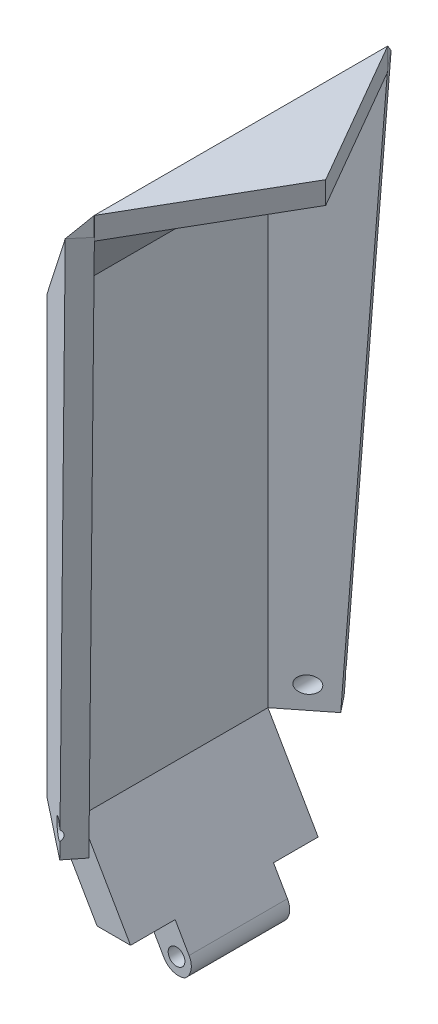
ISO-10303-21;
HEADER;
FILE_DESCRIPTION(('STEP AP214'),'2;1');
FILE_NAME('part.step','',(''),(''),'','','');
FILE_SCHEMA(('AUTOMOTIVE_DESIGN { 1 0 10303 214 1 1 1 1 }'));
ENDSEC;
DATA;
#1=APPLICATION_CONTEXT('core data for automotive mechanical design processes');
#2=APPLICATION_PROTOCOL_DEFINITION('international standard','automotive_design',2000,#1);
#3=PRODUCT_CONTEXT('',#1,'mechanical');
#4=PRODUCT('Part','Part','',(#3));
#5=PRODUCT_RELATED_PRODUCT_CATEGORY('part','',(#4));
#6=PRODUCT_DEFINITION_FORMATION('','',#4);
#7=PRODUCT_DEFINITION_CONTEXT('part definition',#1,'design');
#8=PRODUCT_DEFINITION('design','',#6,#7);
#9=PRODUCT_DEFINITION_SHAPE('','',#8);
#10=(LENGTH_UNIT() NAMED_UNIT(*) SI_UNIT(.MILLI.,.METRE.));
#11=(NAMED_UNIT(*) PLANE_ANGLE_UNIT() SI_UNIT($,.RADIAN.));
#12=(NAMED_UNIT(*) SI_UNIT($,.STERADIAN.) SOLID_ANGLE_UNIT());
#13=UNCERTAINTY_MEASURE_WITH_UNIT(LENGTH_MEASURE(1.E-05),#10,'distance_accuracy_value','');
#14=(GEOMETRIC_REPRESENTATION_CONTEXT(3) GLOBAL_UNCERTAINTY_ASSIGNED_CONTEXT((#13)) GLOBAL_UNIT_ASSIGNED_CONTEXT((#10,
#11,#12)) REPRESENTATION_CONTEXT('',''));
#15=CARTESIAN_POINT('',(0.,0.,0.));
#16=DIRECTION('',(0.,0.,1.));
#17=DIRECTION('',(1.,0.,0.));
#18=AXIS2_PLACEMENT_3D('',#15,#16,#17);
#19=CARTESIAN_POINT('',(10.6552487881726,61.009489218439,-25.5140098827498));
#20=DIRECTION('',(1.,0.,0.));
#21=DIRECTION('',(0.,0.,-1.));
#22=AXIS2_PLACEMENT_3D('',#19,#20,#21);
#23=PLANE('',#22);
#24=DIRECTION('',(0.,0.999852512753469,-0.0171741882071135));
#25=VECTOR('',#24,1.);
#26=CARTESIAN_POINT('',(10.6552487881726,58.409489218439,-25.4693504067082));
#27=LINE('',#26,#25);
#28=CARTESIAN_POINT('',(10.6552487881726,58.409489218439,-25.4693504067082));
#29=VERTEX_POINT('',#28);
#30=CARTESIAN_POINT('',(10.6552487881726,61.009489218439,-25.5140098827498));
#31=VERTEX_POINT('',#30);
#32=EDGE_CURVE('E217',#29,#31,#27,.T.);
#33=ORIENTED_EDGE('',*,*,#32,.F.);
#34=DIRECTION('',(0.,-0.995398370226501,0.0958231942194899));
#35=VECTOR('',#34,1.);
#36=CARTESIAN_POINT('',(10.6552487881726,60.9898755199771,-25.7177543273187));
#37=LINE('',#36,#35);
#38=CARTESIAN_POINT('',(10.6552487881726,58.8734058101279,-25.5140098827498));
#39=VERTEX_POINT('',#38);
#40=EDGE_CURVE('E375',#39,#29,#37,.T.);
#41=ORIENTED_EDGE('',*,*,#40,.F.);
#42=DIRECTION('',(0.,-1.,0.));
#43=VECTOR('',#42,1.);
#44=CARTESIAN_POINT('',(10.6552487881726,61.009489218439,-25.5140098827498));
#45=LINE('',#44,#43);
#46=EDGE_CURVE('E328',#31,#39,#45,.T.);
#47=ORIENTED_EDGE('',*,*,#46,.F.);
#48=EDGE_LOOP('',(#33,#41,#47));
#49=FACE_BOUND('',#48,.T.);
#50=ADVANCED_FACE('F38',(#49),#23,.T.);
#51=CARTESIAN_POINT('',(-1.03375671481459,-6.59051078156102,2.52181160048272));
#52=DIRECTION('',(0.,1.,0.));
#53=DIRECTION('',(0.,0.,1.));
#54=AXIS2_PLACEMENT_3D('',#51,#52,#53);
#55=PLANE('',#54);
#56=DIRECTION('',(-1.,0.,0.));
#57=VECTOR('',#56,1.);
#58=CARTESIAN_POINT('',(-1.03375671481459,-6.59051078156102,2.52181160048272));
#59=LINE('',#58,#57);
#60=CARTESIAN_POINT('',(2.86624328518541,-6.59051078156102,2.52181160048272));
#61=VERTEX_POINT('',#60);
#62=CARTESIAN_POINT('',(-1.03375671481459,-6.59051078156102,2.52181160048272));
#63=VERTEX_POINT('',#62);
#64=EDGE_CURVE('E270',#61,#63,#59,.T.);
#65=ORIENTED_EDGE('',*,*,#64,.F.);
#66=DIRECTION('',(-0.78460232937221,0.,-0.619999342534895));
#67=VECTOR('',#66,1.);
#68=CARTESIAN_POINT('',(2.86624328518541,-6.59051078156102,2.52181160048272));
#69=LINE('',#68,#67);
#70=CARTESIAN_POINT('',(7.60528130297296,-6.59051078156102,6.26663919693801));
#71=VERTEX_POINT('',#70);
#72=EDGE_CURVE('E346',#71,#61,#69,.T.);
#73=ORIENTED_EDGE('',*,*,#72,.F.);
#74=DIRECTION('',(-0.619999342534895,0.,0.78460232937221));
#75=VECTOR('',#74,1.);
#76=CARTESIAN_POINT('',(7.71812277306325,-6.59051078156102,6.12383956118252));
#77=LINE('',#76,#75);
#78=CARTESIAN_POINT('',(6.10612448247252,-6.59051078156102,8.16380561755026));
#79=VERTEX_POINT('',#78);
#80=EDGE_CURVE('E299',#71,#79,#77,.T.);
#81=ORIENTED_EDGE('',*,*,#80,.T.);
#82=DIRECTION('',(0.78460232937221,0.,0.619999342534895));
#83=VECTOR('',#82,1.);
#84=CARTESIAN_POINT('',(9.16607356702414,-6.59051078156102,10.5818030534364));
#85=LINE('',#84,#83);
#86=EDGE_CURVE('E343',#63,#79,#85,.T.);
#87=ORIENTED_EDGE('',*,*,#86,.F.);
#88=EDGE_LOOP('',(#65,#73,#81,#87));
#89=FACE_BOUND('',#88,.T.);
#90=ADVANCED_FACE('F447',(#89),#55,.F.);
#91=DIRECTION('',(1.,0.,0.));
#92=VECTOR('',#91,1.);
#93=CARTESIAN_POINT('',(2.86624328518541,-6.59051078156102,-19.3441883995173));
#94=LINE('',#93,#92);
#95=CARTESIAN_POINT('',(-1.03375671481459,-6.59051078156102,-19.3441883995173));
#96=VERTEX_POINT('',#95);
#97=CARTESIAN_POINT('',(2.86624328518541,-6.59051078156102,-19.3441883995173));
#98=VERTEX_POINT('',#97);
#99=EDGE_CURVE('E267',#96,#98,#94,.T.);
#100=ORIENTED_EDGE('',*,*,#99,.F.);
#101=DIRECTION('',(-0.785505244815182,0.,0.618854999469053));
#102=VECTOR('',#101,1.);
#103=CARTESIAN_POINT('',(-1.03375671481459,-6.59051078156102,-19.3441883995173));
#104=LINE('',#103,#102);
#105=CARTESIAN_POINT('',(6.11434101300356,-6.59051078156102,-24.9757688946857));
#106=VERTEX_POINT('',#105);
#107=EDGE_CURVE('E355',#106,#96,#104,.T.);
#108=ORIENTED_EDGE('',*,*,#107,.F.);
#109=DIRECTION('',(-0.618854999469053,0.,-0.785505244815181));
#110=VECTOR('',#109,1.);
#111=CARTESIAN_POINT('',(7.7233640116231,-6.59051078156102,-22.9334552581662));
#112=LINE('',#111,#110);
#113=CARTESIAN_POINT('',(7.60796890343815,-6.59051078156102,-23.0799248880198));
#114=VERTEX_POINT('',#113);
#115=EDGE_CURVE('E286',#114,#106,#112,.T.);
#116=ORIENTED_EDGE('',*,*,#115,.F.);
#117=DIRECTION('',(0.785505244815181,0.,-0.618854999469053));
#118=VECTOR('',#117,1.);
#119=CARTESIAN_POINT('',(10.6714393582173,-6.59051078156102,-25.4934593859491));
#120=LINE('',#119,#118);
#121=EDGE_CURVE('E352',#98,#114,#120,.T.);
#122=ORIENTED_EDGE('',*,*,#121,.F.);
#123=EDGE_LOOP('',(#100,#108,#116,#122));
#124=FACE_BOUND('',#123,.T.);
#125=ADVANCED_FACE('F466',(#124),#55,.F.);
#126=CARTESIAN_POINT('',(9.16607356702414,58.409489218439,10.5818030534364));
#127=DIRECTION('',(0.619999342534895,0.,-0.78460232937221));
#128=DIRECTION('',(-0.78460232937221,0.,-0.619999342534895));
#129=AXIS2_PLACEMENT_3D('',#126,#127,#128);
#130=PLANE('',#129);
#131=DIRECTION('',(-0.0466718581353723,-0.998229215578194,-0.0368804938190356));
#132=VECTOR('',#131,1.);
#133=CARTESIAN_POINT('',(9.16607356702414,58.8564351172174,10.5818030534364));
#134=LINE('',#133,#132);
#135=CARTESIAN_POINT('',(6.1975367142933,-4.6353634163107,8.23604032997316));
#136=VERTEX_POINT('',#135);
#137=EDGE_CURVE('E295',#136,#79,#134,.T.);
#138=ORIENTED_EDGE('',*,*,#137,.F.);
#139=CARTESIAN_POINT('',(5.46624328518541,-3.99051078156102,7.65816612762435));
#140=DIRECTION('',(0.619999342534895,0.,-0.78460232937221));
#141=DIRECTION('',(0.78460232937221,0.,0.619999342534895));
#142=AXIS2_PLACEMENT_3D('',#139,#140,#141);
#143=ELLIPSE('',#142,1.242667735616,0.975000000000001);
#144=CARTESIAN_POINT('',(6.25451466882144,-3.41670486860738,8.28106478761744));
#145=VERTEX_POINT('',#144);
#146=EDGE_CURVE('E52',#136,#145,#143,.T.);
#147=ORIENTED_EDGE('',*,*,#146,.T.);
#148=CARTESIAN_POINT('',(9.16607356702414,58.8564351172174,10.5818030534364));
#149=VERTEX_POINT('',#148);
#150=EDGE_CURVE('E296',#149,#145,#134,.T.);
#151=ORIENTED_EDGE('',*,*,#150,.F.);
#152=DIRECTION('',(0.518840292974444,0.750140886581608,0.409991951951196));
#153=VECTOR('',#152,1.);
#154=CARTESIAN_POINT('',(-1.0337567148146,44.109489218439,2.52181160048272));
#155=LINE('',#154,#153);
#156=CARTESIAN_POINT('',(-1.0337567148146,44.109489218439,2.52181160048272));
#157=VERTEX_POINT('',#156);
#158=EDGE_CURVE('E321',#157,#149,#155,.T.);
#159=ORIENTED_EDGE('',*,*,#158,.F.);
#160=DIRECTION('',(0.,-1.,0.));
#161=VECTOR('',#160,1.);
#162=CARTESIAN_POINT('',(-1.03375671481459,58.409489218439,2.52181160048272));
#163=LINE('',#162,#161);
#164=EDGE_CURVE('E361',#157,#63,#163,.T.);
#165=ORIENTED_EDGE('',*,*,#164,.T.);
#166=ORIENTED_EDGE('',*,*,#86,.T.);
#167=EDGE_LOOP('',(#138,#147,#151,#159,#165,#166));
#168=FACE_BOUND('',#167,.T.);
#169=ADVANCED_FACE('F442',(#168),#130,.F.);
#170=CARTESIAN_POINT('',(10.6624675122414,58.409489218439,8.68245338559817));
#171=DIRECTION('',(-0.785504411843749,0.,-0.61885605674826));
#172=DIRECTION('',(-0.61885605674826,0.,0.785504411843749));
#173=AXIS2_PLACEMENT_3D('',#170,#171,#172);
#174=PLANE('',#173);
#175=DIRECTION('',(0.461195463716863,0.66679781567586,-0.585388261973957));
#176=VECTOR('',#175,1.);
#177=CARTESIAN_POINT('',(9.16607356702414,58.8564351172174,10.5818030534364));
#178=LINE('',#177,#176);
#179=CARTESIAN_POINT('',(10.6552487881726,61.009489218439,8.69161600030012));
#180=VERTEX_POINT('',#179);
#181=EDGE_CURVE('E324',#149,#180,#178,.T.);
#182=ORIENTED_EDGE('',*,*,#181,.F.);
#183=DIRECTION('',(0.618671331821346,-0.0244315215937749,-0.785269943353886));
#184=VECTOR('',#183,1.);
#185=CARTESIAN_POINT('',(10.6683299397326,58.7971105500014,8.67501229714437));
#186=LINE('',#185,#184);
#187=CARTESIAN_POINT('',(10.6552487881726,58.7976271287087,8.69161600030012));
#188=VERTEX_POINT('',#187);
#189=EDGE_CURVE('E308',#149,#188,#186,.T.);
#190=ORIENTED_EDGE('',*,*,#189,.T.);
#191=DIRECTION('',(0.,-1.,0.));
#192=VECTOR('',#191,1.);
#193=CARTESIAN_POINT('',(10.6552487881726,61.009489218439,8.69161600030012));
#194=LINE('',#193,#192);
#195=EDGE_CURVE('E333',#180,#188,#194,.T.);
#196=ORIENTED_EDGE('',*,*,#195,.F.);
#197=EDGE_LOOP('',(#182,#190,#196));
#198=FACE_BOUND('',#197,.T.);
#199=ADVANCED_FACE('F436',(#198),#174,.F.);
#200=CARTESIAN_POINT('',(2.86624328518541,58.409489218439,2.52181160048272));
#201=DIRECTION('',(-0.619999342534895,0.,0.78460232937221));
#202=DIRECTION('',(0.78460232937221,0.,0.619999342534895));
#203=AXIS2_PLACEMENT_3D('',#200,#201,#202);
#204=PLANE('',#203);
#205=CARTESIAN_POINT('',(5.46624328518541,-3.99051078156102,4.57635341133937));
#206=DIRECTION('',(-0.619999342534895,0.,0.78460232937221));
#207=DIRECTION('',(0.78460232937221,0.,0.619999342534895));
#208=AXIS2_PLACEMENT_3D('',#205,#206,#207);
#209=ELLIPSE('',#208,1.242667735616,0.975000000000001);
#210=CARTESIAN_POINT('',(6.44124328518541,-3.99051078156102,5.34680659041061));
#211=VERTEX_POINT('',#210);
#212=EDGE_CURVE('E231',#211,#211,#209,.T.);
#213=ORIENTED_EDGE('',*,*,#212,.T.);
#214=EDGE_LOOP('',(#213));
#215=FACE_BOUND('',#214,.T.);
#216=DIRECTION('',(0.518840292974444,0.750140886581608,0.409991951951196));
#217=VECTOR('',#216,1.);
#218=CARTESIAN_POINT('',(7.24920508475906,53.4850207875722,5.9852647822564));
#219=LINE('',#218,#217);
#220=CARTESIAN_POINT('',(2.86624328518541,47.1481211776041,2.52181160048272));
#221=VERTEX_POINT('',#220);
#222=CARTESIAN_POINT('',(10.643542249408,58.3925638687957,8.66749848414715));
#223=VERTEX_POINT('',#222);
#224=EDGE_CURVE('E340',#221,#223,#219,.T.);
#225=ORIENTED_EDGE('',*,*,#224,.T.);
#226=DIRECTION('',(-0.0466718581353723,-0.998229215578194,-0.0368804938190356));
#227=VECTOR('',#226,1.);
#228=CARTESIAN_POINT('',(10.6168113355184,57.8208364881043,8.64637549175152));
#229=LINE('',#228,#227);
#230=EDGE_CURVE('E305',#223,#71,#229,.T.);
#231=ORIENTED_EDGE('',*,*,#230,.T.);
#232=ORIENTED_EDGE('',*,*,#72,.T.);
#233=DIRECTION('',(0.,-1.,0.));
#234=VECTOR('',#233,1.);
#235=CARTESIAN_POINT('',(2.86624328518541,58.409489218439,2.52181160048272));
#236=LINE('',#235,#234);
#237=EDGE_CURVE('E370',#221,#61,#236,.T.);
#238=ORIENTED_EDGE('',*,*,#237,.F.);
#239=EDGE_LOOP('',(#225,#231,#232,#238));
#240=FACE_BOUND('',#239,.T.);
#241=ADVANCED_FACE('F450',(#215,#240),#204,.F.);
#242=CARTESIAN_POINT('',(2.86624328518541,58.409489218439,-19.3441883995173));
#243=DIRECTION('',(-1.,0.,0.));
#244=DIRECTION('',(0.,0.,1.));
#245=AXIS2_PLACEMENT_3D('',#242,#243,#244);
#246=PLANE('',#245);
#247=DIRECTION('',(0.,-1.,0.));
#248=VECTOR('',#247,1.);
#249=CARTESIAN_POINT('',(2.86624328518541,58.409489218439,-19.3441883995173));
#250=LINE('',#249,#248);
#251=CARTESIAN_POINT('',(2.86624328518541,47.1481211776041,-19.3441883995173));
#252=VERTEX_POINT('',#251);
#253=EDGE_CURVE('E367',#252,#98,#250,.T.);
#254=ORIENTED_EDGE('',*,*,#253,.F.);
#255=DIRECTION('',(0.,0.,1.));
#256=VECTOR('',#255,1.);
#257=CARTESIAN_POINT('',(2.86624328518541,47.1481211776041,-19.3441883995173));
#258=LINE('',#257,#256);
#259=EDGE_CURVE('E338',#252,#221,#258,.T.);
#260=ORIENTED_EDGE('',*,*,#259,.T.);
#261=ORIENTED_EDGE('',*,*,#237,.T.);
#262=DIRECTION('',(0.,0.,-1.));
#263=VECTOR('',#262,1.);
#264=CARTESIAN_POINT('',(2.86624328518541,-6.59051078156102,-19.3441883995173));
#265=LINE('',#264,#263);
#266=EDGE_CURVE('E349',#61,#98,#265,.T.);
#267=ORIENTED_EDGE('',*,*,#266,.T.);
#268=EDGE_LOOP('',(#254,#260,#261,#267));
#269=FACE_BOUND('',#268,.T.);
#270=ADVANCED_FACE('F454',(#269),#246,.F.);
#271=CARTESIAN_POINT('',(10.6714393582173,58.409489218439,-25.4934593859491));
#272=DIRECTION('',(-0.618854999469053,0.,-0.785505244815181));
#273=DIRECTION('',(-0.785505244815182,0.,0.618854999469053));
#274=AXIS2_PLACEMENT_3D('',#271,#272,#273);
#275=PLANE('',#274);
#276=CARTESIAN_POINT('',(5.46624328518541,-3.99051078156102,-21.3925808313184));
#277=DIRECTION('',(-0.618854999469053,0.,-0.785505244815181));
#278=DIRECTION('',(-0.785505244815182,0.,0.618854999469053));
#279=AXIS2_PLACEMENT_3D('',#276,#277,#278);
#280=ELLIPSE('',#279,1.24123932518032,0.975000000000001);
#281=CARTESIAN_POINT('',(4.49124328518541,-3.99051078156102,-20.624433669393));
#282=VERTEX_POINT('',#281);
#283=EDGE_CURVE('E228',#282,#282,#280,.T.);
#284=ORIENTED_EDGE('',*,*,#283,.T.);
#285=EDGE_LOOP('',(#284));
#286=FACE_BOUND('',#285,.T.);
#287=ORIENTED_EDGE('',*,*,#121,.T.);
#288=DIRECTION('',(0.0467134976488242,0.998230131130508,-0.0368029134795434));
#289=VECTOR('',#288,1.);
#290=CARTESIAN_POINT('',(10.6498065467254,58.4111299083174,-25.4764161215881));
#291=LINE('',#290,#289);
#292=CARTESIAN_POINT('',(10.649329263725,58.4009307518407,-25.4760400974012));
#293=VERTEX_POINT('',#292);
#294=EDGE_CURVE('E292',#114,#293,#291,.T.);
#295=ORIENTED_EDGE('',*,*,#294,.T.);
#296=DIRECTION('',(-0.519101135037937,-0.750518012836866,0.408970321673502));
#297=VECTOR('',#296,1.);
#298=CARTESIAN_POINT('',(10.662319577838,58.4197121878194,-25.4862744285996));
#299=LINE('',#298,#297);
#300=EDGE_CURVE('E336',#293,#252,#299,.T.);
#301=ORIENTED_EDGE('',*,*,#300,.T.);
#302=ORIENTED_EDGE('',*,*,#253,.T.);
#303=EDGE_LOOP('',(#287,#295,#301,#302));
#304=FACE_BOUND('',#303,.T.);
#305=ADVANCED_FACE('F469',(#286,#304),#275,.F.);
#306=CARTESIAN_POINT('',(9.17781146778277,58.409489218439,-27.389303392615));
#307=DIRECTION('',(-0.785505244815182,0.,0.618854999469053));
#308=DIRECTION('',(0.618854999469053,0.,0.785505244815182));
#309=AXIS2_PLACEMENT_3D('',#306,#307,#308);
#310=PLANE('',#309);
#311=ORIENTED_EDGE('',*,*,#46,.T.);
#312=DIRECTION('',(-0.618854999469053,0.,-0.785505244815181));
#313=VECTOR('',#312,1.);
#314=CARTESIAN_POINT('',(10.7868344664023,58.8734058101279,-25.3469897560955));
#315=LINE('',#314,#313);
#316=CARTESIAN_POINT('',(9.17781146778277,58.8734058101279,-27.389303392615));
#317=VERTEX_POINT('',#316);
#318=EDGE_CURVE('E285',#39,#317,#315,.T.);
#319=ORIENTED_EDGE('',*,*,#318,.T.);
#320=DIRECTION('',(-0.461195026117854,-0.66679718299387,-0.585389327401509));
#321=VECTOR('',#320,1.);
#322=CARTESIAN_POINT('',(10.6552487881726,61.009489218439,-25.5140098827498));
#323=LINE('',#322,#321);
#324=EDGE_CURVE('E312',#31,#317,#323,.T.);
#325=ORIENTED_EDGE('',*,*,#324,.F.);
#326=EDGE_LOOP('',(#311,#319,#325));
#327=FACE_BOUND('',#326,.T.);
#328=ADVANCED_FACE('F409',(#327),#310,.F.);
#329=CARTESIAN_POINT('',(-1.03375671481459,58.409489218439,-19.3441883995173));
#330=DIRECTION('',(0.618854999469053,0.,0.785505244815181));
#331=DIRECTION('',(0.785505244815182,0.,-0.618854999469053));
#332=AXIS2_PLACEMENT_3D('',#329,#330,#331);
#333=PLANE('',#332);
#334=DIRECTION('',(0.0467134976488242,0.998230131130508,-0.0368029134795434));
#335=VECTOR('',#334,1.);
#336=CARTESIAN_POINT('',(6.11434101300356,-6.59051078156102,-24.9757688946857));
#337=LINE('',#336,#335);
#338=CARTESIAN_POINT('',(6.26235222953769,-3.42762931204697,-25.0923785315204));
#339=VERTEX_POINT('',#338);
#340=EDGE_CURVE('E281',#339,#317,#337,.T.);
#341=ORIENTED_EDGE('',*,*,#340,.F.);
#342=CARTESIAN_POINT('',(5.46624328518541,-3.99051078156102,-24.4651694790202));
#343=DIRECTION('',(0.618854999469053,0.,0.785505244815181));
#344=DIRECTION('',(-0.785505244815182,0.,0.618854999469053));
#345=AXIS2_PLACEMENT_3D('',#342,#343,#344);
#346=ELLIPSE('',#345,1.24123932518032,0.975000000000001);
#347=CARTESIAN_POINT('',(6.20630660869124,-4.62527946163393,-25.0482233678367));
#348=VERTEX_POINT('',#347);
#349=EDGE_CURVE('E59',#339,#348,#346,.T.);
#350=ORIENTED_EDGE('',*,*,#349,.T.);
#351=EDGE_CURVE('E282',#106,#348,#337,.T.);
#352=ORIENTED_EDGE('',*,*,#351,.F.);
#353=ORIENTED_EDGE('',*,*,#107,.T.);
#354=DIRECTION('',(0.,-1.,0.));
#355=VECTOR('',#354,1.);
#356=CARTESIAN_POINT('',(-1.03375671481459,58.409489218439,-19.3441883995173));
#357=LINE('',#356,#355);
#358=CARTESIAN_POINT('',(-1.0337567148146,44.109489218439,-19.3441883995173));
#359=VERTEX_POINT('',#358);
#360=EDGE_CURVE('E364',#359,#96,#357,.T.);
#361=ORIENTED_EDGE('',*,*,#360,.F.);
#362=DIRECTION('',(-0.519101135037937,-0.750518012836866,0.408970321673502));
#363=VECTOR('',#362,1.);
#364=CARTESIAN_POINT('',(9.17781146778277,58.8734058101279,-27.389303392615));
#365=LINE('',#364,#363);
#366=EDGE_CURVE('E315',#317,#359,#365,.T.);
#367=ORIENTED_EDGE('',*,*,#366,.F.);
#368=EDGE_LOOP('',(#341,#350,#352,#353,#361,#367));
#369=FACE_BOUND('',#368,.T.);
#370=ADVANCED_FACE('F403',(#369),#333,.F.);
#371=CARTESIAN_POINT('',(-1.03375671481459,58.409489218439,2.52181160048272));
#372=DIRECTION('',(1.,0.,0.));
#373=DIRECTION('',(0.,0.,-1.));
#374=AXIS2_PLACEMENT_3D('',#371,#372,#373);
#375=PLANE('',#374);
#376=ORIENTED_EDGE('',*,*,#164,.F.);
#377=DIRECTION('',(0.,0.,1.));
#378=VECTOR('',#377,1.);
#379=CARTESIAN_POINT('',(-1.0337567148146,44.109489218439,-19.3441883995173));
#380=LINE('',#379,#378);
#381=EDGE_CURVE('E318',#359,#157,#380,.T.);
#382=ORIENTED_EDGE('',*,*,#381,.F.);
#383=ORIENTED_EDGE('',*,*,#360,.T.);
#384=DIRECTION('',(0.,0.,1.));
#385=VECTOR('',#384,1.);
#386=CARTESIAN_POINT('',(-1.03375671481459,-6.59051078156102,2.52181160048272));
#387=LINE('',#386,#385);
#388=EDGE_CURVE('E358',#96,#63,#387,.T.);
#389=ORIENTED_EDGE('',*,*,#388,.T.);
#390=EDGE_LOOP('',(#376,#382,#383,#389));
#391=FACE_BOUND('',#390,.T.);
#392=ADVANCED_FACE('F480',(#391),#375,.F.);
#393=CARTESIAN_POINT('',(-23.5370997346549,8.97408687491964,2.52181160048271));
#394=DIRECTION('',(0.822442515397556,-0.568848230081224,0.));
#395=DIRECTION('',(0.568848230081224,0.822442515397556,0.));
#396=AXIS2_PLACEMENT_3D('',#393,#394,#395);
#397=PLANE('',#396);
#398=DIRECTION('',(-0.478502514165268,-0.691820402285413,-0.540758610582548));
#399=VECTOR('',#398,1.);
#400=CARTESIAN_POINT('',(-6.295742393376,33.9016941887454,-44.6257689582841));
#401=LINE('',#400,#399);
#402=EDGE_CURVE('E288',#29,#293,#401,.T.);
#403=ORIENTED_EDGE('',*,*,#402,.F.);
#404=DIRECTION('',(0.,0.,1.));
#405=VECTOR('',#404,1.);
#406=CARTESIAN_POINT('',(10.6552487881726,58.409489218439,-25.5140098827498));
#407=LINE('',#406,#405);
#408=CARTESIAN_POINT('',(10.6552487881726,58.409489218439,8.65431074156123));
#409=VERTEX_POINT('',#408);
#410=EDGE_CURVE('E311',#29,#409,#407,.T.);
#411=ORIENTED_EDGE('',*,*,#410,.T.);
#412=DIRECTION('',(0.478945460047605,0.692460814800367,-0.539545425581387));
#413=VECTOR('',#412,1.);
#414=CARTESIAN_POINT('',(-11.998673773547,25.6563785115255,34.1745866586477));
#415=LINE('',#414,#413);
#416=EDGE_CURVE('E302',#223,#409,#415,.T.);
#417=ORIENTED_EDGE('',*,*,#416,.F.);
#418=ORIENTED_EDGE('',*,*,#224,.F.);
#419=ORIENTED_EDGE('',*,*,#259,.F.);
#420=ORIENTED_EDGE('',*,*,#300,.F.);
#421=EDGE_LOOP('',(#403,#411,#417,#418,#419,#420));
#422=FACE_BOUND('',#421,.T.);
#423=ADVANCED_FACE('F424',(#422),#397,.T.);
#424=DIRECTION('',(0.,-0.999897080807172,-0.0143466997352976));
#425=VECTOR('',#424,1.);
#426=CARTESIAN_POINT('',(10.6552487881726,61.009489218439,8.69161600030012));
#427=LINE('',#426,#425);
#428=EDGE_CURVE('E214',#180,#409,#427,.T.);
#429=ORIENTED_EDGE('',*,*,#428,.F.);
#430=ORIENTED_EDGE('',*,*,#195,.T.);
#431=DIRECTION('',(0.,0.995412862948437,0.0956725262381807));
#432=VECTOR('',#431,1.);
#433=CARTESIAN_POINT('',(10.6552487881726,57.7317164744252,8.58916769082436));
#434=LINE('',#433,#432);
#435=EDGE_CURVE('E373',#409,#188,#434,.T.);
#436=ORIENTED_EDGE('',*,*,#435,.F.);
#437=EDGE_LOOP('',(#429,#430,#436));
#438=FACE_BOUND('',#437,.T.);
#439=ADVANCED_FACE('F431',(#438),#23,.T.);
#440=CARTESIAN_POINT('',(-23.5370997346549,11.5740868749196,2.52181160048271));
#441=DIRECTION('',(0.822442515397556,-0.568848230081224,0.));
#442=DIRECTION('',(0.568848230081224,0.822442515397556,0.));
#443=AXIS2_PLACEMENT_3D('',#440,#441,#442);
#444=PLANE('',#443);
#445=ORIENTED_EDGE('',*,*,#324,.T.);
#446=ORIENTED_EDGE('',*,*,#366,.T.);
#447=ORIENTED_EDGE('',*,*,#381,.T.);
#448=ORIENTED_EDGE('',*,*,#158,.T.);
#449=ORIENTED_EDGE('',*,*,#181,.T.);
#450=DIRECTION('',(0.,0.,1.));
#451=VECTOR('',#450,1.);
#452=CARTESIAN_POINT('',(10.6552487881726,61.009489218439,-25.5140098827498));
#453=LINE('',#452,#451);
#454=EDGE_CURVE('E201',#31,#180,#453,.T.);
#455=ORIENTED_EDGE('',*,*,#454,.F.);
#456=EDGE_LOOP('',(#445,#446,#447,#448,#449,#455));
#457=FACE_BOUND('',#456,.T.);
#458=ADVANCED_FACE('F407',(#457),#444,.F.);
#459=CARTESIAN_POINT('',(10.7780718576149,58.8564351172174,8.54183699706861));
#460=DIRECTION('',(-0.783212967790045,0.0594847305293068,-0.618901457357604));
#461=DIRECTION('',(-0.619999342534895,0.,0.78460232937221));
#462=AXIS2_PLACEMENT_3D('',#459,#460,#461);
#463=PLANE('',#462);
#464=ORIENTED_EDGE('',*,*,#150,.T.);
#465=CARTESIAN_POINT('',(5.46624328518541,-3.99051078156102,9.22346308505167));
#466=DIRECTION('',(-0.783212967790045,0.0594847305293068,-0.618901457357604));
#467=DIRECTION('',(-0.617124124186075,0.046870345282873,0.785468641054902));
#468=AXIS2_PLACEMENT_3D('',#465,#466,#467);
#469=ELLIPSE('',#468,1.57537195689077,0.975000000000001);
#470=EDGE_CURVE('E225',#145,#136,#469,.T.);
#471=ORIENTED_EDGE('',*,*,#470,.T.);
#472=ORIENTED_EDGE('',*,*,#137,.T.);
#473=ORIENTED_EDGE('',*,*,#80,.F.);
#474=ORIENTED_EDGE('',*,*,#230,.F.);
#475=ORIENTED_EDGE('',*,*,#416,.T.);
#476=ORIENTED_EDGE('',*,*,#435,.T.);
#477=ORIENTED_EDGE('',*,*,#189,.F.);
#478=EDGE_LOOP('',(#464,#471,#472,#473,#474,#475,#476,#477));
#479=FACE_BOUND('',#478,.T.);
#480=ADVANCED_FACE('F439',(#479),#463,.F.);
#481=CARTESIAN_POINT('',(7.7233640116231,-6.59051078156102,-22.9334552581662));
#482=DIRECTION('',(-0.78411500353556,0.0594693644086555,0.617759707270763));
#483=DIRECTION('',(0.618854999469053,0.,0.785505244815181));
#484=AXIS2_PLACEMENT_3D('',#481,#482,#483);
#485=PLANE('',#484);
#486=ORIENTED_EDGE('',*,*,#351,.T.);
#487=CARTESIAN_POINT('',(5.46624328518541,-3.99051078156102,-26.0486836409877));
#488=DIRECTION('',(-0.78411500353556,0.0594693644086555,0.617759707270763));
#489=DIRECTION('',(0.615990625169088,-0.046718365029773,0.786366927122918));
#490=AXIS2_PLACEMENT_3D('',#487,#488,#489);
#491=ELLIPSE('',#490,1.57828357616185,0.975000000000001);
#492=EDGE_CURVE('E46',#348,#339,#491,.T.);
#493=ORIENTED_EDGE('',*,*,#492,.T.);
#494=ORIENTED_EDGE('',*,*,#340,.T.);
#495=ORIENTED_EDGE('',*,*,#318,.F.);
#496=ORIENTED_EDGE('',*,*,#40,.T.);
#497=ORIENTED_EDGE('',*,*,#402,.T.);
#498=ORIENTED_EDGE('',*,*,#294,.F.);
#499=ORIENTED_EDGE('',*,*,#115,.T.);
#500=EDGE_LOOP('',(#486,#493,#494,#495,#496,#497,#498,#499));
#501=FACE_BOUND('',#500,.T.);
#502=ADVANCED_FACE('F399',(#501),#485,.F.);
#503=CARTESIAN_POINT('',(7.41624328518543,-21.226340105518,-19.3441883995173));
#504=DIRECTION('',(0.866025403784438,0.500000000000001,0.));
#505=DIRECTION('',(-0.500000000000001,0.866025403784438,0.));
#506=AXIS2_PLACEMENT_3D('',#503,#504,#505);
#507=PLANE('',#506);
#508=DIRECTION('',(-0.500000000000001,0.866025403784438,0.));
#509=VECTOR('',#508,1.);
#510=CARTESIAN_POINT('',(4.81624328518542,-16.7230080058389,-14.1441883995173));
#511=LINE('',#510,#509);
#512=CARTESIAN_POINT('',(7.41624328518543,-21.226340105518,-14.1441883995173));
#513=VERTEX_POINT('',#512);
#514=CARTESIAN_POINT('',(4.81624328518542,-16.7230080058389,-14.1441883995173));
#515=VERTEX_POINT('',#514);
#516=EDGE_CURVE('E238',#513,#515,#511,.T.);
#517=ORIENTED_EDGE('',*,*,#516,.F.);
#518=DIRECTION('',(0.,0.,-1.));
#519=VECTOR('',#518,1.);
#520=CARTESIAN_POINT('',(7.41624328518543,-21.226340105518,-2.67818839951728));
#521=LINE('',#520,#519);
#522=CARTESIAN_POINT('',(7.41624328518543,-21.226340105518,-2.67818839951728));
#523=VERTEX_POINT('',#522);
#524=EDGE_CURVE('E392',#513,#523,#521,.F.);
#525=ORIENTED_EDGE('',*,*,#524,.T.);
#526=DIRECTION('',(0.500000000000001,-0.866025403784438,0.));
#527=VECTOR('',#526,1.);
#528=CARTESIAN_POINT('',(4.81624328518542,-16.7230080058389,-2.67818839951728));
#529=LINE('',#528,#527);
#530=CARTESIAN_POINT('',(4.81624328518542,-16.7230080058389,-2.67818839951728));
#531=VERTEX_POINT('',#530);
#532=EDGE_CURVE('E252',#531,#523,#529,.T.);
#533=ORIENTED_EDGE('',*,*,#532,.F.);
#534=DIRECTION('',(0.,0.,-1.));
#535=VECTOR('',#534,1.);
#536=CARTESIAN_POINT('',(4.81624328518542,-16.7230080058389,2.52181160048272));
#537=LINE('',#536,#535);
#538=CARTESIAN_POINT('',(4.81624328518542,-16.7230080058389,2.52181160048272));
#539=VERTEX_POINT('',#538);
#540=EDGE_CURVE('E241',#539,#531,#537,.T.);
#541=ORIENTED_EDGE('',*,*,#540,.F.);
#542=DIRECTION('',(-0.500000000000001,0.866025403784438,0.));
#543=VECTOR('',#542,1.);
#544=CARTESIAN_POINT('',(7.41624328518543,-21.226340105518,2.52181160048272));
#545=LINE('',#544,#543);
#546=EDGE_CURVE('E273',#539,#63,#545,.T.);
#547=ORIENTED_EDGE('',*,*,#546,.T.);
#548=ORIENTED_EDGE('',*,*,#388,.F.);
#549=DIRECTION('',(-0.500000000000001,0.866025403784438,0.));
#550=VECTOR('',#549,1.);
#551=CARTESIAN_POINT('',(7.41624328518543,-21.226340105518,-19.3441883995173));
#552=LINE('',#551,#550);
#553=CARTESIAN_POINT('',(4.81624328518542,-16.7230080058389,-19.3441883995173));
#554=VERTEX_POINT('',#553);
#555=EDGE_CURVE('E279',#554,#96,#552,.T.);
#556=ORIENTED_EDGE('',*,*,#555,.F.);
#557=DIRECTION('',(0.,0.,-1.));
#558=VECTOR('',#557,1.);
#559=CARTESIAN_POINT('',(4.81624328518542,-16.7230080058389,-19.3441883995173));
#560=LINE('',#559,#558);
#561=EDGE_CURVE('E240',#515,#554,#560,.T.);
#562=ORIENTED_EDGE('',*,*,#561,.F.);
#563=EDGE_LOOP('',(#517,#525,#533,#541,#547,#548,#556,#562));
#564=FACE_BOUND('',#563,.T.);
#565=ADVANCED_FACE('F476',(#564),#507,.F.);
#566=CARTESIAN_POINT('',(11.3162432851854,-21.226340105518,-19.3441883995173));
#567=DIRECTION('',(0.,0.,1.));
#568=DIRECTION('',(1.,0.,0.));
#569=AXIS2_PLACEMENT_3D('',#566,#567,#568);
#570=PLANE('',#569);
#571=DIRECTION('',(-0.500000000000001,0.866025403784438,0.));
#572=VECTOR('',#571,1.);
#573=CARTESIAN_POINT('',(11.3162432851854,-21.226340105518,-19.3441883995173));
#574=LINE('',#573,#572);
#575=CARTESIAN_POINT('',(8.71624328518542,-16.7230080058389,-19.3441883995173));
#576=VERTEX_POINT('',#575);
#577=EDGE_CURVE('E277',#576,#98,#574,.T.);
#578=ORIENTED_EDGE('',*,*,#577,.F.);
#579=DIRECTION('',(-1.,0.,0.));
#580=VECTOR('',#579,1.);
#581=CARTESIAN_POINT('',(24.3162432851854,-16.7230080058389,-19.3441883995173));
#582=LINE('',#581,#580);
#583=EDGE_CURVE('E244',#576,#554,#582,.T.);
#584=ORIENTED_EDGE('',*,*,#583,.T.);
#585=ORIENTED_EDGE('',*,*,#555,.T.);
#586=ORIENTED_EDGE('',*,*,#99,.T.);
#587=EDGE_LOOP('',(#578,#584,#585,#586));
#588=FACE_BOUND('',#587,.T.);
#589=ADVANCED_FACE('F470',(#588),#570,.F.);
#590=CARTESIAN_POINT('',(11.3162432851854,-21.226340105518,2.52181160048272));
#591=DIRECTION('',(-0.866025403784438,-0.500000000000001,0.));
#592=DIRECTION('',(0.500000000000001,-0.866025403784438,0.));
#593=AXIS2_PLACEMENT_3D('',#590,#591,#592);
#594=PLANE('',#593);
#595=DIRECTION('',(0.500000000000001,-0.866025403784438,0.));
#596=VECTOR('',#595,1.);
#597=CARTESIAN_POINT('',(11.3162432851854,-21.226340105518,-2.67818839951728));
#598=LINE('',#597,#596);
#599=CARTESIAN_POINT('',(8.71624328518542,-16.7230080058389,-2.67818839951728));
#600=VERTEX_POINT('',#599);
#601=CARTESIAN_POINT('',(10.3412432851854,-19.5375905681384,-2.67818839951728));
#602=VERTEX_POINT('',#601);
#603=EDGE_CURVE('E247',#600,#602,#598,.T.);
#604=ORIENTED_EDGE('',*,*,#603,.T.);
#605=DIRECTION('',(0.,0.,1.));
#606=VECTOR('',#605,1.);
#607=CARTESIAN_POINT('',(10.3412432851854,-19.5375905681384,-14.1441883995173));
#608=LINE('',#607,#606);
#609=CARTESIAN_POINT('',(10.3412432851854,-19.5375905681384,-14.1441883995173));
#610=VERTEX_POINT('',#609);
#611=EDGE_CURVE('E385',#602,#610,#608,.F.);
#612=ORIENTED_EDGE('',*,*,#611,.T.);
#613=DIRECTION('',(-0.500000000000001,0.866025403784438,0.));
#614=VECTOR('',#613,1.);
#615=CARTESIAN_POINT('',(11.3162432851854,-21.226340105518,-14.1441883995173));
#616=LINE('',#615,#614);
#617=CARTESIAN_POINT('',(8.71624328518542,-16.7230080058389,-14.1441883995173));
#618=VERTEX_POINT('',#617);
#619=EDGE_CURVE('E262',#610,#618,#616,.T.);
#620=ORIENTED_EDGE('',*,*,#619,.T.);
#621=DIRECTION('',(0.,0.,-1.));
#622=VECTOR('',#621,1.);
#623=CARTESIAN_POINT('',(8.71624328518542,-16.7230080058389,2.52181160048272));
#624=LINE('',#623,#622);
#625=EDGE_CURVE('E378',#618,#576,#624,.T.);
#626=ORIENTED_EDGE('',*,*,#625,.T.);
#627=ORIENTED_EDGE('',*,*,#577,.T.);
#628=ORIENTED_EDGE('',*,*,#266,.F.);
#629=DIRECTION('',(-0.500000000000001,0.866025403784438,0.));
#630=VECTOR('',#629,1.);
#631=CARTESIAN_POINT('',(11.3162432851854,-21.226340105518,2.52181160048272));
#632=LINE('',#631,#630);
#633=CARTESIAN_POINT('',(8.71624328518542,-16.7230080058389,2.52181160048272));
#634=VERTEX_POINT('',#633);
#635=EDGE_CURVE('E275',#634,#61,#632,.T.);
#636=ORIENTED_EDGE('',*,*,#635,.F.);
#637=DIRECTION('',(0.,0.,-1.));
#638=VECTOR('',#637,1.);
#639=CARTESIAN_POINT('',(8.71624328518542,-16.7230080058389,2.52181160048272));
#640=LINE('',#639,#638);
#641=EDGE_CURVE('E264',#634,#600,#640,.T.);
#642=ORIENTED_EDGE('',*,*,#641,.T.);
#643=EDGE_LOOP('',(#604,#612,#620,#626,#627,#628,#636,#642));
#644=FACE_BOUND('',#643,.T.);
#645=ADVANCED_FACE('F458',(#644),#594,.F.);
#646=CARTESIAN_POINT('',(7.41624328518543,-21.226340105518,2.52181160048272));
#647=DIRECTION('',(0.,0.,-1.));
#648=DIRECTION('',(-1.,0.,0.));
#649=AXIS2_PLACEMENT_3D('',#646,#647,#648);
#650=PLANE('',#649);
#651=ORIENTED_EDGE('',*,*,#546,.F.);
#652=DIRECTION('',(-1.,0.,0.));
#653=VECTOR('',#652,1.);
#654=CARTESIAN_POINT('',(24.3162432851854,-16.7230080058389,2.52181160048272));
#655=LINE('',#654,#653);
#656=EDGE_CURVE('E250',#634,#539,#655,.T.);
#657=ORIENTED_EDGE('',*,*,#656,.F.);
#658=ORIENTED_EDGE('',*,*,#635,.T.);
#659=ORIENTED_EDGE('',*,*,#64,.T.);
#660=EDGE_LOOP('',(#651,#657,#658,#659));
#661=FACE_BOUND('',#660,.T.);
#662=ADVANCED_FACE('F513',(#661),#650,.F.);
#663=CARTESIAN_POINT('',(24.3162432851854,-16.7230080058389,2.52181160048272));
#664=DIRECTION('',(0.,1.,0.));
#665=DIRECTION('',(0.,0.,1.));
#666=AXIS2_PLACEMENT_3D('',#663,#664,#665);
#667=PLANE('',#666);
#668=ORIENTED_EDGE('',*,*,#656,.T.);
#669=ORIENTED_EDGE('',*,*,#540,.T.);
#670=DIRECTION('',(-1.,0.,0.));
#671=VECTOR('',#670,1.);
#672=CARTESIAN_POINT('',(24.3162432851854,-16.7230080058389,-2.67818839951728));
#673=LINE('',#672,#671);
#674=EDGE_CURVE('E253',#600,#531,#673,.T.);
#675=ORIENTED_EDGE('',*,*,#674,.F.);
#676=ORIENTED_EDGE('',*,*,#641,.F.);
#677=EDGE_LOOP('',(#668,#669,#675,#676));
#678=FACE_BOUND('',#677,.T.);
#679=ADVANCED_FACE('F516',(#678),#667,.F.);
#680=CARTESIAN_POINT('',(24.3162432851854,-16.7230080058389,-2.67818839951728));
#681=DIRECTION('',(0.,0.,-1.));
#682=DIRECTION('',(0.,1.,0.));
#683=AXIS2_PLACEMENT_3D('',#680,#681,#682);
#684=PLANE('',#683);
#685=CARTESIAN_POINT('',(8.87874328518543,-20.3819653368282,-2.67818839951728));
#686=DIRECTION('',(0.,0.,1.));
#687=DIRECTION('',(1.,0.,0.));
#688=AXIS2_PLACEMENT_3D('',#685,#686,#687);
#689=CIRCLE('',#688,0.975000000000001);
#690=CARTESIAN_POINT('',(9.85374328518543,-20.3819653368282,-2.67818839951728));
#691=VERTEX_POINT('',#690);
#692=EDGE_CURVE('E234',#691,#691,#689,.T.);
#693=ORIENTED_EDGE('',*,*,#692,.F.);
#694=EDGE_LOOP('',(#693));
#695=FACE_BOUND('',#694,.T.);
#696=CARTESIAN_POINT('',(9.10499282256508,-20.251340105518,-2.67818839951728));
#697=DIRECTION('',(0.,0.,-1.));
#698=DIRECTION('',(0.,1.,0.));
#699=AXIS2_PLACEMENT_3D('',#696,#697,#698);
#700=CIRCLE('',#699,1.95);
#701=CARTESIAN_POINT('',(9.84495343258875,-22.0554904029194,-2.67818839951728));
#702=VERTEX_POINT('',#701);
#703=EDGE_CURVE('E381',#523,#702,#700,.F.);
#704=ORIENTED_EDGE('',*,*,#703,.T.);
#705=CARTESIAN_POINT('',(8.65249374780577,-20.5125905681384,-2.67818839951728));
#706=DIRECTION('',(0.,0.,-1.));
#707=DIRECTION('',(0.,1.,0.));
#708=AXIS2_PLACEMENT_3D('',#705,#706,#707);
#709=CIRCLE('',#708,1.95);
#710=EDGE_CURVE('E383',#702,#602,#709,.F.);
#711=ORIENTED_EDGE('',*,*,#710,.T.);
#712=ORIENTED_EDGE('',*,*,#603,.F.);
#713=ORIENTED_EDGE('',*,*,#674,.T.);
#714=ORIENTED_EDGE('',*,*,#532,.T.);
#715=EDGE_LOOP('',(#704,#711,#712,#713,#714));
#716=FACE_BOUND('',#715,.T.);
#717=ADVANCED_FACE('F518',(#695,#716),#684,.F.);
#718=CARTESIAN_POINT('',(24.3162432851854,-16.7230080058389,-19.3441883995173));
#719=DIRECTION('',(0.,1.,0.));
#720=DIRECTION('',(0.,0.,1.));
#721=AXIS2_PLACEMENT_3D('',#718,#719,#720);
#722=PLANE('',#721);
#723=DIRECTION('',(-1.,0.,0.));
#724=VECTOR('',#723,1.);
#725=CARTESIAN_POINT('',(24.3162432851854,-16.7230080058389,-14.1441883995173));
#726=LINE('',#725,#724);
#727=EDGE_CURVE('E243',#618,#515,#726,.T.);
#728=ORIENTED_EDGE('',*,*,#727,.T.);
#729=ORIENTED_EDGE('',*,*,#561,.T.);
#730=ORIENTED_EDGE('',*,*,#583,.F.);
#731=ORIENTED_EDGE('',*,*,#625,.F.);
#732=EDGE_LOOP('',(#728,#729,#730,#731));
#733=FACE_BOUND('',#732,.T.);
#734=ADVANCED_FACE('F521',(#733),#722,.F.);
#735=CARTESIAN_POINT('',(24.3162432851854,-16.7230080058389,-14.1441883995173));
#736=DIRECTION('',(0.,0.,1.));
#737=DIRECTION('',(1.,0.,0.));
#738=AXIS2_PLACEMENT_3D('',#735,#736,#737);
#739=PLANE('',#738);
#740=CARTESIAN_POINT('',(8.87874328518543,-20.3819653368282,-14.1441883995173));
#741=DIRECTION('',(0.,0.,1.));
#742=DIRECTION('',(1.,0.,0.));
#743=AXIS2_PLACEMENT_3D('',#740,#741,#742);
#744=CIRCLE('',#743,0.975000000000001);
#745=CARTESIAN_POINT('',(9.85374328518543,-20.3819653368282,-14.1441883995173));
#746=VERTEX_POINT('',#745);
#747=EDGE_CURVE('E237',#746,#746,#744,.T.);
#748=ORIENTED_EDGE('',*,*,#747,.T.);
#749=EDGE_LOOP('',(#748));
#750=FACE_BOUND('',#749,.T.);
#751=ORIENTED_EDGE('',*,*,#619,.F.);
#752=CARTESIAN_POINT('',(8.65249374780577,-20.5125905681384,-14.1441883995173));
#753=DIRECTION('',(0.,0.,1.));
#754=DIRECTION('',(1.,0.,0.));
#755=AXIS2_PLACEMENT_3D('',#752,#753,#754);
#756=CIRCLE('',#755,1.95);
#757=CARTESIAN_POINT('',(9.84495343258875,-22.0554904029194,-14.1441883995173));
#758=VERTEX_POINT('',#757);
#759=EDGE_CURVE('E390',#610,#758,#756,.F.);
#760=ORIENTED_EDGE('',*,*,#759,.T.);
#761=CARTESIAN_POINT('',(9.10499282256508,-20.251340105518,-14.1441883995173));
#762=DIRECTION('',(0.,0.,1.));
#763=DIRECTION('',(1.,0.,0.));
#764=AXIS2_PLACEMENT_3D('',#761,#762,#763);
#765=CIRCLE('',#764,1.95);
#766=EDGE_CURVE('E388',#758,#513,#765,.F.);
#767=ORIENTED_EDGE('',*,*,#766,.T.);
#768=ORIENTED_EDGE('',*,*,#516,.T.);
#769=ORIENTED_EDGE('',*,*,#727,.F.);
#770=EDGE_LOOP('',(#751,#760,#767,#768,#769));
#771=FACE_BOUND('',#770,.T.);
#772=ADVANCED_FACE('F526',(#750,#771),#739,.F.);
#773=CARTESIAN_POINT('',(9.10499282256508,-20.251340105518,1.57173807043488));
#774=DIRECTION('',(0.,0.,1.));
#775=DIRECTION('',(1.,0.,0.));
#776=AXIS2_PLACEMENT_3D('',#773,#774,#775);
#777=CYLINDRICAL_SURFACE('',#776,1.95);
#778=ORIENTED_EDGE('',*,*,#524,.F.);
#779=ORIENTED_EDGE('',*,*,#766,.F.);
#780=DIRECTION('',(0.,0.,1.));
#781=VECTOR('',#780,1.);
#782=CARTESIAN_POINT('',(9.84495343258875,-22.0554904029194,-8.41118839951728));
#783=LINE('',#782,#781);
#784=EDGE_CURVE('E255',#702,#758,#783,.F.);
#785=ORIENTED_EDGE('',*,*,#784,.F.);
#786=ORIENTED_EDGE('',*,*,#703,.F.);
#787=EDGE_LOOP('',(#778,#779,#785,#786));
#788=FACE_BOUND('',#787,.T.);
#789=ADVANCED_FACE('F40',(#788),#777,.T.);
#790=CARTESIAN_POINT('',(8.65249374780577,-20.5125905681384,1.57173807043488));
#791=DIRECTION('',(0.,0.,-1.));
#792=DIRECTION('',(-1.,0.,0.));
#793=AXIS2_PLACEMENT_3D('',#790,#791,#792);
#794=CYLINDRICAL_SURFACE('',#793,1.95);
#795=ORIENTED_EDGE('',*,*,#759,.F.);
#796=ORIENTED_EDGE('',*,*,#611,.F.);
#797=ORIENTED_EDGE('',*,*,#710,.F.);
#798=ORIENTED_EDGE('',*,*,#784,.T.);
#799=EDGE_LOOP('',(#795,#796,#797,#798));
#800=FACE_BOUND('',#799,.T.);
#801=ADVANCED_FACE('F537',(#800),#794,.T.);
#802=CARTESIAN_POINT('',(8.87874328518543,-20.3819653368282,-27.389303392615));
#803=DIRECTION('',(0.,0.,1.));
#804=DIRECTION('',(1.,0.,0.));
#805=AXIS2_PLACEMENT_3D('',#802,#803,#804);
#806=CYLINDRICAL_SURFACE('',#805,0.975000000000001);
#807=ORIENTED_EDGE('',*,*,#692,.T.);
#808=EDGE_LOOP('',(#807));
#809=FACE_BOUND('',#808,.T.);
#810=ORIENTED_EDGE('',*,*,#747,.F.);
#811=EDGE_LOOP('',(#810));
#812=FACE_BOUND('',#811,.T.);
#813=ADVANCED_FACE('F533',(#809,#812),#806,.F.);
#814=CARTESIAN_POINT('',(5.46624328518541,-3.99051078156102,-27.389303392615));
#815=DIRECTION('',(0.,0.,1.));
#816=DIRECTION('',(1.,0.,0.));
#817=AXIS2_PLACEMENT_3D('',#814,#815,#816);
#818=CYLINDRICAL_SURFACE('',#817,0.975000000000001);
#819=ORIENTED_EDGE('',*,*,#492,.F.);
#820=ORIENTED_EDGE('',*,*,#349,.F.);
#821=EDGE_LOOP('',(#819,#820));
#822=FACE_BOUND('',#821,.T.);
#823=ORIENTED_EDGE('',*,*,#283,.F.);
#824=EDGE_LOOP('',(#823));
#825=FACE_BOUND('',#824,.T.);
#826=ADVANCED_FACE('F536',(#822,#825),#818,.F.);
#827=ORIENTED_EDGE('',*,*,#470,.F.);
#828=ORIENTED_EDGE('',*,*,#146,.F.);
#829=EDGE_LOOP('',(#827,#828));
#830=FACE_BOUND('',#829,.T.);
#831=ORIENTED_EDGE('',*,*,#212,.F.);
#832=EDGE_LOOP('',(#831));
#833=FACE_BOUND('',#832,.T.);
#834=ADVANCED_FACE('F539',(#830,#833),#818,.F.);
#835=CARTESIAN_POINT('',(20.5352487881726,61.009489218439,-25.5140098827498));
#836=DIRECTION('',(0.,-1.,0.));
#837=DIRECTION('',(0.,0.,-1.));
#838=AXIS2_PLACEMENT_3D('',#835,#836,#837);
#839=PLANE('',#838);
#840=ORIENTED_EDGE('',*,*,#454,.T.);
#841=DIRECTION('',(-0.500215905502009,0.,0.865900714795181));
#842=VECTOR('',#841,1.);
#843=CARTESIAN_POINT('',(20.5352487881726,61.009489218439,-8.41119694122486));
#844=LINE('',#843,#842);
#845=CARTESIAN_POINT('',(20.5352487881726,61.009489218439,-8.41119694122486));
#846=VERTEX_POINT('',#845);
#847=EDGE_CURVE('E187',#846,#180,#844,.T.);
#848=ORIENTED_EDGE('',*,*,#847,.F.);
#849=DIRECTION('',(0.500215905502009,0.,0.865900714795181));
#850=VECTOR('',#849,1.);
#851=CARTESIAN_POINT('',(10.6552487881726,61.009489218439,-25.5140098827498));
#852=LINE('',#851,#850);
#853=EDGE_CURVE('E198',#31,#846,#852,.T.);
#854=ORIENTED_EDGE('',*,*,#853,.F.);
#855=EDGE_LOOP('',(#840,#848,#854));
#856=FACE_BOUND('',#855,.T.);
#857=ADVANCED_FACE('F197',(#856),#839,.F.);
#858=CARTESIAN_POINT('',(20.5352487881726,61.009489218439,8.69161600030012));
#859=DIRECTION('',(0.,0.0143466997352976,-0.999897080807172));
#860=DIRECTION('',(0.,0.999897080807173,0.0143466997352976));
#861=AXIS2_PLACEMENT_3D('',#858,#859,#860);
#862=PLANE('',#861);
#863=DIRECTION('',(-1.,0.,0.));
#864=VECTOR('',#863,1.);
#865=CARTESIAN_POINT('',(20.5352487881726,58.409489218439,8.65431074156123));
#866=LINE('',#865,#864);
#867=CARTESIAN_POINT('',(10.6767993926024,58.409489218439,8.65431074156123));
#868=VERTEX_POINT('',#867);
#869=EDGE_CURVE('E222',#868,#409,#866,.T.);
#870=ORIENTED_EDGE('',*,*,#869,.F.);
#871=DIRECTION('',(-0.00828755632155608,0.999862741957072,0.0143462070354177));
#872=VECTOR('',#871,1.);
#873=CARTESIAN_POINT('',(10.6559273820397,60.9276194008156,8.69044131771191));
#874=LINE('',#873,#872);
#875=EDGE_CURVE('E206',#868,#180,#874,.T.);
#876=ORIENTED_EDGE('',*,*,#875,.T.);
#877=ORIENTED_EDGE('',*,*,#428,.T.);
#878=EDGE_LOOP('',(#870,#876,#877));
#879=FACE_BOUND('',#878,.T.);
#880=ADVANCED_FACE('F429',(#879),#862,.F.);
#881=CARTESIAN_POINT('',(20.5352487881726,58.409489218439,8.65431074156123));
#882=DIRECTION('',(0.,1.,0.));
#883=DIRECTION('',(0.,0.,1.));
#884=AXIS2_PLACEMENT_3D('',#881,#882,#883);
#885=PLANE('',#884);
#886=DIRECTION('',(0.500215905502009,0.,0.865900714795181));
#887=VECTOR('',#886,1.);
#888=CARTESIAN_POINT('',(27.926956881831,58.409489218439,4.38424848834961));
#889=LINE('',#888,#887);
#890=CARTESIAN_POINT('',(10.6810477970725,58.409489218439,-25.4693504067082));
#891=VERTEX_POINT('',#890);
#892=CARTESIAN_POINT('',(20.5352487881726,58.409489218439,-8.41119694122486));
#893=VERTEX_POINT('',#892);
#894=EDGE_CURVE('E208',#891,#893,#889,.T.);
#895=ORIENTED_EDGE('',*,*,#894,.T.);
#896=DIRECTION('',(-0.500215905502009,0.,0.865900714795181));
#897=VECTOR('',#896,1.);
#898=CARTESIAN_POINT('',(13.1435406945142,58.409489218439,4.38424848834961));
#899=LINE('',#898,#897);
#900=EDGE_CURVE('E190',#893,#868,#899,.T.);
#901=ORIENTED_EDGE('',*,*,#900,.T.);
#902=ORIENTED_EDGE('',*,*,#869,.T.);
#903=ORIENTED_EDGE('',*,*,#410,.F.);
#904=DIRECTION('',(-1.,0.,0.));
#905=VECTOR('',#904,1.);
#906=CARTESIAN_POINT('',(20.5352487881726,58.409489218439,-25.4693504067082));
#907=LINE('',#906,#905);
#908=EDGE_CURVE('E220',#891,#29,#907,.T.);
#909=ORIENTED_EDGE('',*,*,#908,.F.);
#910=EDGE_LOOP('',(#895,#901,#902,#903,#909));
#911=FACE_BOUND('',#910,.T.);
#912=ADVANCED_FACE('F419',(#911),#885,.F.);
#913=CARTESIAN_POINT('',(20.5352487881726,58.409489218439,-25.4693504067082));
#914=DIRECTION('',(0.,0.0171741882071135,0.999852512753469));
#915=DIRECTION('',(0.,-0.99985251275347,0.0171741882071135));
#916=AXIS2_PLACEMENT_3D('',#913,#914,#915);
#917=PLANE('',#916);
#918=ORIENTED_EDGE('',*,*,#32,.T.);
#919=DIRECTION('',(0.00992074401803706,-0.999803308219745,0.0171733430345385));
#920=VECTOR('',#919,1.);
#921=CARTESIAN_POINT('',(10.6820176589833,58.3117474416902,-25.4676715234247));
#922=LINE('',#921,#920);
#923=EDGE_CURVE('E205',#31,#891,#922,.T.);
#924=ORIENTED_EDGE('',*,*,#923,.T.);
#925=ORIENTED_EDGE('',*,*,#908,.T.);
#926=EDGE_LOOP('',(#918,#924,#925));
#927=FACE_BOUND('',#926,.T.);
#928=ADVANCED_FACE('F415',(#927),#917,.F.);
#929=CARTESIAN_POINT('',(10.6552487881726,57.109489218439,-25.5140098827498));
#930=DIRECTION('',(-0.865900714795181,0.,0.500215905502009));
#931=DIRECTION('',(0.500215905502009,0.,0.865900714795181));
#932=AXIS2_PLACEMENT_3D('',#929,#930,#931);
#933=PLANE('',#932);
#934=ORIENTED_EDGE('',*,*,#923,.F.);
#935=ORIENTED_EDGE('',*,*,#853,.T.);
#936=DIRECTION('',(0.,-1.,0.));
#937=VECTOR('',#936,1.);
#938=CARTESIAN_POINT('',(20.5352487881726,-6.59051078156102,-8.41119694122486));
#939=LINE('',#938,#937);
#940=EDGE_CURVE('E11',#846,#893,#939,.T.);
#941=ORIENTED_EDGE('',*,*,#940,.T.);
#942=ORIENTED_EDGE('',*,*,#894,.F.);
#943=EDGE_LOOP('',(#934,#935,#941,#942));
#944=FACE_BOUND('',#943,.T.);
#945=ADVANCED_FACE('F203',(#944),#933,.F.);
#946=CARTESIAN_POINT('',(20.5352487881726,57.109489218439,-8.41119694122486));
#947=DIRECTION('',(-0.865900714795181,0.,-0.500215905502009));
#948=DIRECTION('',(-0.500215905502009,0.,0.865900714795181));
#949=AXIS2_PLACEMENT_3D('',#946,#947,#948);
#950=PLANE('',#949);
#951=ORIENTED_EDGE('',*,*,#900,.F.);
#952=ORIENTED_EDGE('',*,*,#940,.F.);
#953=ORIENTED_EDGE('',*,*,#847,.T.);
#954=ORIENTED_EDGE('',*,*,#875,.F.);
#955=EDGE_LOOP('',(#951,#952,#953,#954));
#956=FACE_BOUND('',#955,.T.);
#957=ADVANCED_FACE('F186',(#956),#950,.F.);
#958=CLOSED_SHELL('',(#50,#90,#125,#169,#199,#241,#270,#305,#328,#370,#392,#423,#439,#458,#480,
#502,#565,#589,#645,#662,#679,#717,#734,#772,#789,#801,#813,#826,#834,#857,#880,#912,#928,#945,#957));
#959=MANIFOLD_SOLID_BREP('B2',#958);
#960=ADVANCED_BREP_SHAPE_REPRESENTATION('',(#18,#959),#14);
#961=SHAPE_DEFINITION_REPRESENTATION(#9,#960);
ENDSEC;
END-ISO-10303-21;
